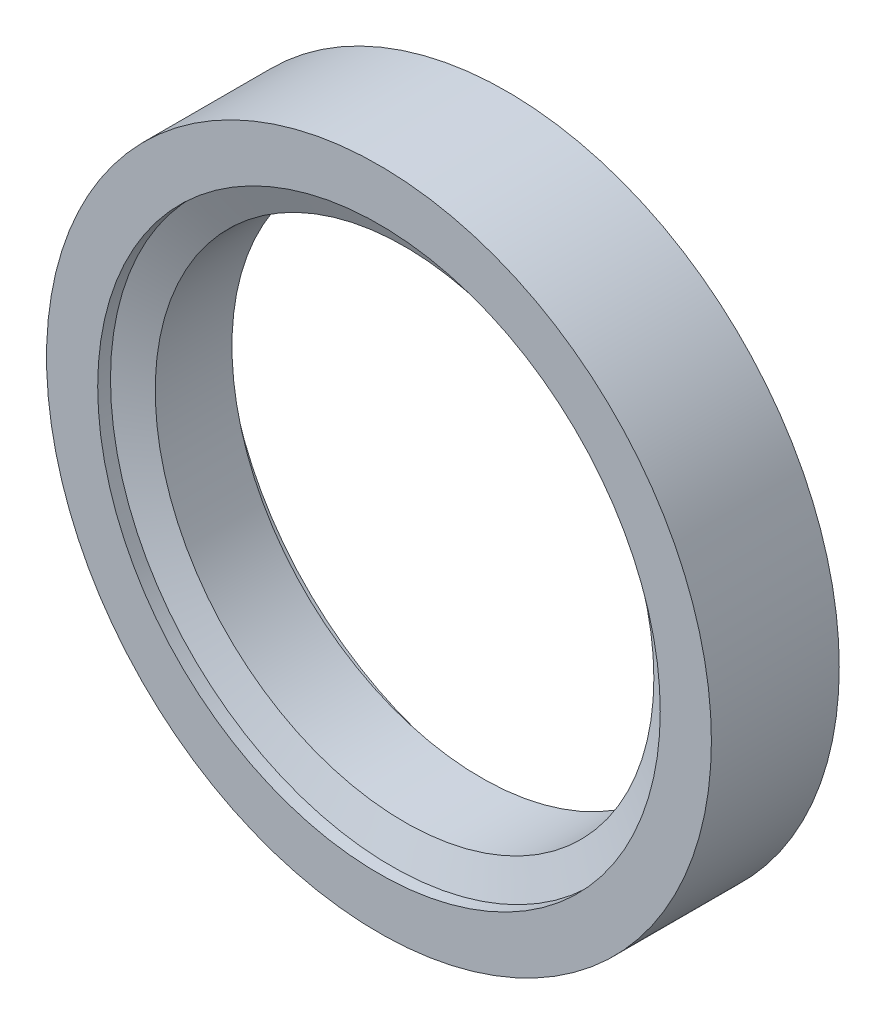
ISO-10303-21;
HEADER;
FILE_DESCRIPTION(('STEP AP214'),'2;1');
FILE_NAME('part.step','',(''),(''),'','','');
FILE_SCHEMA(('AUTOMOTIVE_DESIGN { 1 0 10303 214 1 1 1 1 }'));
ENDSEC;
DATA;
#1=APPLICATION_CONTEXT('core data for automotive mechanical design processes');
#2=APPLICATION_PROTOCOL_DEFINITION('international standard','automotive_design',2000,#1);
#3=PRODUCT_CONTEXT('',#1,'mechanical');
#4=PRODUCT('Part','Part','',(#3));
#5=PRODUCT_RELATED_PRODUCT_CATEGORY('part','',(#4));
#6=PRODUCT_DEFINITION_FORMATION('','',#4);
#7=PRODUCT_DEFINITION_CONTEXT('part definition',#1,'design');
#8=PRODUCT_DEFINITION('design','',#6,#7);
#9=PRODUCT_DEFINITION_SHAPE('','',#8);
#10=(LENGTH_UNIT() NAMED_UNIT(*) SI_UNIT(.MILLI.,.METRE.));
#11=(NAMED_UNIT(*) PLANE_ANGLE_UNIT() SI_UNIT($,.RADIAN.));
#12=(NAMED_UNIT(*) SI_UNIT($,.STERADIAN.) SOLID_ANGLE_UNIT());
#13=UNCERTAINTY_MEASURE_WITH_UNIT(LENGTH_MEASURE(1.E-05),#10,'distance_accuracy_value','');
#14=(GEOMETRIC_REPRESENTATION_CONTEXT(3) GLOBAL_UNCERTAINTY_ASSIGNED_CONTEXT((#13)) GLOBAL_UNIT_ASSIGNED_CONTEXT((#10,
#11,#12)) REPRESENTATION_CONTEXT('',''));
#15=CARTESIAN_POINT('',(0.,0.,0.));
#16=DIRECTION('',(0.,0.,1.));
#17=DIRECTION('',(1.,0.,0.));
#18=AXIS2_PLACEMENT_3D('',#15,#16,#17);
#19=CARTESIAN_POINT('',(0.,0.,5.));
#20=DIRECTION('',(0.,0.,-1.));
#21=DIRECTION('',(-1.,0.,0.));
#22=AXIS2_PLACEMENT_3D('',#19,#20,#21);
#23=CYLINDRICAL_SURFACE('',#22,22.);
#24=CARTESIAN_POINT('',(0.,0.,-5.));
#25=DIRECTION('',(0.,0.,1.));
#26=DIRECTION('',(1.,0.,0.));
#27=AXIS2_PLACEMENT_3D('',#24,#25,#26);
#28=CIRCLE('',#27,22.);
#29=CARTESIAN_POINT('',(22.,0.,-5.));
#30=VERTEX_POINT('',#29);
#31=EDGE_CURVE('E52',#30,#30,#28,.T.);
#32=ORIENTED_EDGE('',*,*,#31,.F.);
#33=EDGE_LOOP('',(#32));
#34=FACE_BOUND('',#33,.T.);
#35=CARTESIAN_POINT('',(0.,0.,-4.));
#36=DIRECTION('',(0.,0.,1.));
#37=DIRECTION('',(1.,0.,0.));
#38=AXIS2_PLACEMENT_3D('',#35,#36,#37);
#39=CIRCLE('',#38,22.);
#40=CARTESIAN_POINT('',(22.,0.,-4.));
#41=VERTEX_POINT('',#40);
#42=EDGE_CURVE('E66',#41,#41,#39,.T.);
#43=ORIENTED_EDGE('',*,*,#42,.T.);
#44=EDGE_LOOP('',(#43));
#45=FACE_BOUND('',#44,.T.);
#46=ADVANCED_FACE('F37',(#34,#45),#23,.F.);
#47=CARTESIAN_POINT('',(0.,0.,5.));
#48=DIRECTION('',(0.,0.,1.));
#49=DIRECTION('',(1.,0.,0.));
#50=AXIS2_PLACEMENT_3D('',#47,#48,#49);
#51=CIRCLE('',#50,22.);
#52=CARTESIAN_POINT('',(22.,0.,5.));
#53=VERTEX_POINT('',#52);
#54=EDGE_CURVE('E44',#53,#53,#51,.T.);
#55=ORIENTED_EDGE('',*,*,#54,.T.);
#56=EDGE_LOOP('',(#55));
#57=FACE_BOUND('',#56,.T.);
#58=CARTESIAN_POINT('',(0.,0.,4.));
#59=DIRECTION('',(0.,0.,1.));
#60=DIRECTION('',(1.,0.,0.));
#61=AXIS2_PLACEMENT_3D('',#58,#59,#60);
#62=CIRCLE('',#61,22.);
#63=CARTESIAN_POINT('',(22.,0.,4.));
#64=VERTEX_POINT('',#63);
#65=EDGE_CURVE('E63',#64,#64,#62,.T.);
#66=ORIENTED_EDGE('',*,*,#65,.F.);
#67=EDGE_LOOP('',(#66));
#68=FACE_BOUND('',#67,.T.);
#69=ADVANCED_FACE('F90',(#57,#68),#23,.F.);
#70=CARTESIAN_POINT('',(0.,0.,5.));
#71=DIRECTION('',(0.,0.,1.));
#72=DIRECTION('',(1.,0.,0.));
#73=AXIS2_PLACEMENT_3D('',#70,#71,#72);
#74=PLANE('',#73);
#75=CARTESIAN_POINT('',(0.,0.,5.));
#76=DIRECTION('',(0.,0.,1.));
#77=DIRECTION('',(1.,0.,0.));
#78=AXIS2_PLACEMENT_3D('',#75,#76,#77);
#79=CIRCLE('',#78,26.);
#80=CARTESIAN_POINT('',(26.,0.,5.));
#81=VERTEX_POINT('',#80);
#82=EDGE_CURVE('E10',#81,#81,#79,.T.);
#83=ORIENTED_EDGE('',*,*,#82,.T.);
#84=EDGE_LOOP('',(#83));
#85=FACE_BOUND('',#84,.T.);
#86=ORIENTED_EDGE('',*,*,#54,.F.);
#87=EDGE_LOOP('',(#86));
#88=FACE_BOUND('',#87,.T.);
#89=ADVANCED_FACE('F92',(#85,#88),#74,.T.);
#90=CARTESIAN_POINT('',(0.,0.,5.));
#91=DIRECTION('',(0.,0.,-1.));
#92=DIRECTION('',(-1.,0.,0.));
#93=AXIS2_PLACEMENT_3D('',#90,#91,#92);
#94=CYLINDRICAL_SURFACE('',#93,26.);
#95=ORIENTED_EDGE('',*,*,#82,.F.);
#96=EDGE_LOOP('',(#95));
#97=FACE_BOUND('',#96,.T.);
#98=CARTESIAN_POINT('',(0.,0.,-5.));
#99=DIRECTION('',(0.,0.,1.));
#100=DIRECTION('',(1.,0.,0.));
#101=AXIS2_PLACEMENT_3D('',#98,#99,#100);
#102=CIRCLE('',#101,26.);
#103=CARTESIAN_POINT('',(26.,0.,-5.));
#104=VERTEX_POINT('',#103);
#105=EDGE_CURVE('E48',#104,#104,#102,.T.);
#106=ORIENTED_EDGE('',*,*,#105,.T.);
#107=EDGE_LOOP('',(#106));
#108=FACE_BOUND('',#107,.T.);
#109=ADVANCED_FACE('F39',(#97,#108),#94,.T.);
#110=CARTESIAN_POINT('',(0.,0.,-5.));
#111=DIRECTION('',(0.,0.,1.));
#112=DIRECTION('',(1.,0.,0.));
#113=AXIS2_PLACEMENT_3D('',#110,#111,#112);
#114=PLANE('',#113);
#115=ORIENTED_EDGE('',*,*,#31,.T.);
#116=EDGE_LOOP('',(#115));
#117=FACE_BOUND('',#116,.T.);
#118=ORIENTED_EDGE('',*,*,#105,.F.);
#119=EDGE_LOOP('',(#118));
#120=FACE_BOUND('',#119,.T.);
#121=ADVANCED_FACE('F75',(#117,#120),#114,.F.);
#122=CARTESIAN_POINT('',(0.,0.,-3.00000000000001));
#123=DIRECTION('',(0.,0.,-1.));
#124=DIRECTION('',(-1.,0.,0.));
#125=AXIS2_PLACEMENT_3D('',#122,#123,#124);
#126=CONICAL_SURFACE('',#125,19.5,1.19028994968253);
#127=ORIENTED_EDGE('',*,*,#42,.F.);
#128=EDGE_LOOP('',(#127));
#129=FACE_BOUND('',#128,.T.);
#130=CARTESIAN_POINT('',(0.,0.,-3.00000000000001));
#131=DIRECTION('',(0.,0.,1.));
#132=DIRECTION('',(1.,0.,0.));
#133=AXIS2_PLACEMENT_3D('',#130,#131,#132);
#134=CIRCLE('',#133,19.5);
#135=CARTESIAN_POINT('',(19.5,0.,-3.00000000000001));
#136=VERTEX_POINT('',#135);
#137=EDGE_CURVE('E57',#136,#136,#134,.T.);
#138=ORIENTED_EDGE('',*,*,#137,.T.);
#139=EDGE_LOOP('',(#138));
#140=FACE_BOUND('',#139,.T.);
#141=ADVANCED_FACE('F71',(#129,#140),#126,.F.);
#142=CARTESIAN_POINT('',(0.,0.,5.));
#143=DIRECTION('',(0.,0.,1.));
#144=DIRECTION('',(1.,0.,0.));
#145=AXIS2_PLACEMENT_3D('',#142,#143,#144);
#146=CYLINDRICAL_SURFACE('',#145,19.5);
#147=ORIENTED_EDGE('',*,*,#137,.F.);
#148=EDGE_LOOP('',(#147));
#149=FACE_BOUND('',#148,.T.);
#150=CARTESIAN_POINT('',(0.,0.,3.));
#151=DIRECTION('',(0.,0.,1.));
#152=DIRECTION('',(1.,0.,0.));
#153=AXIS2_PLACEMENT_3D('',#150,#151,#152);
#154=CIRCLE('',#153,19.5);
#155=CARTESIAN_POINT('',(19.5,0.,3.));
#156=VERTEX_POINT('',#155);
#157=EDGE_CURVE('E60',#156,#156,#154,.T.);
#158=ORIENTED_EDGE('',*,*,#157,.T.);
#159=EDGE_LOOP('',(#158));
#160=FACE_BOUND('',#159,.T.);
#161=ADVANCED_FACE('F74',(#149,#160),#146,.F.);
#162=CARTESIAN_POINT('',(0.,0.,4.));
#163=DIRECTION('',(0.,0.,1.));
#164=DIRECTION('',(1.,0.,0.));
#165=AXIS2_PLACEMENT_3D('',#162,#163,#164);
#166=CONICAL_SURFACE('',#165,22.,1.19028994968253);
#167=ORIENTED_EDGE('',*,*,#157,.F.);
#168=EDGE_LOOP('',(#167));
#169=FACE_BOUND('',#168,.T.);
#170=ORIENTED_EDGE('',*,*,#65,.T.);
#171=EDGE_LOOP('',(#170));
#172=FACE_BOUND('',#171,.T.);
#173=ADVANCED_FACE('F81',(#169,#172),#166,.F.);
#174=CLOSED_SHELL('',(#46,#69,#89,#109,#121,#141,#161,#173));
#175=MANIFOLD_SOLID_BREP('B2',#174);
#176=ADVANCED_BREP_SHAPE_REPRESENTATION('',(#18,#175),#14);
#177=SHAPE_DEFINITION_REPRESENTATION(#9,#176);
ENDSEC;
END-ISO-10303-21;
